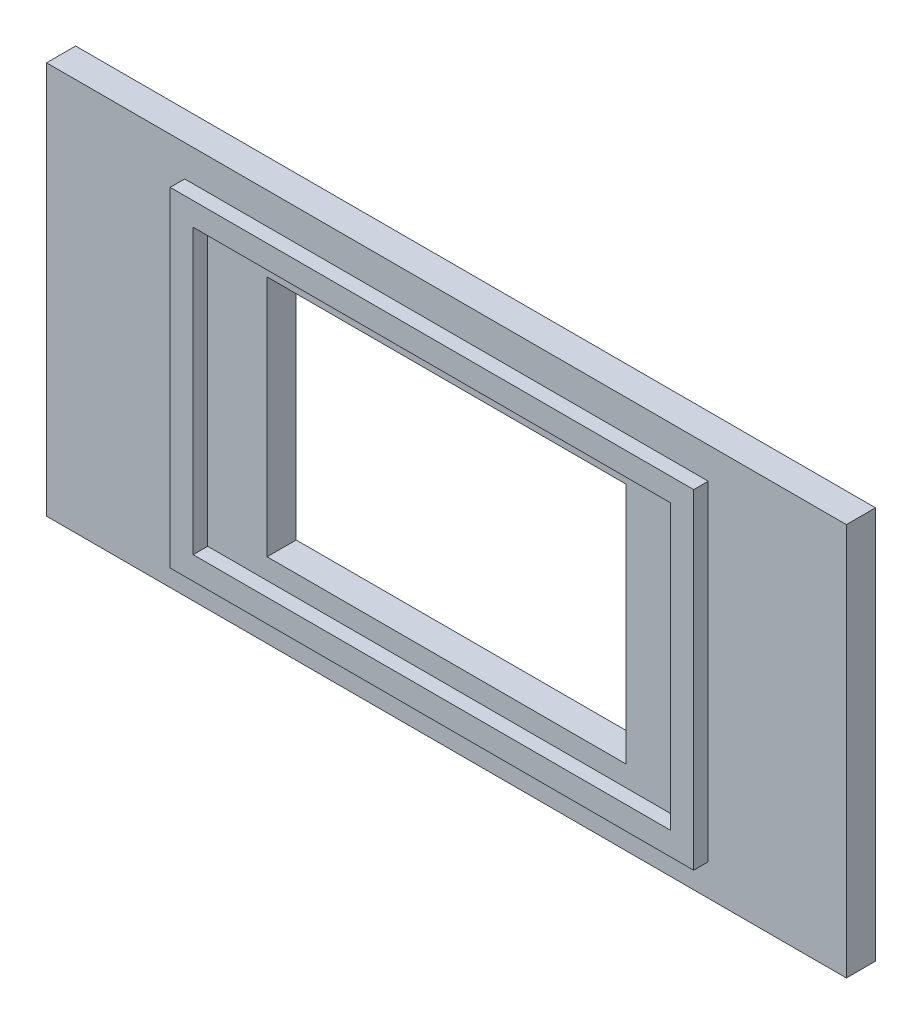
ISO-10303-21;
HEADER;
FILE_DESCRIPTION(('STEP AP214'),'2;1');
FILE_NAME('part.step','',(''),(''),'','','');
FILE_SCHEMA(('AUTOMOTIVE_DESIGN { 1 0 10303 214 1 1 1 1 }'));
ENDSEC;
DATA;
#1=APPLICATION_CONTEXT('core data for automotive mechanical design processes');
#2=APPLICATION_PROTOCOL_DEFINITION('international standard','automotive_design',2000,#1);
#3=PRODUCT_CONTEXT('',#1,'mechanical');
#4=PRODUCT('Part','Part','',(#3));
#5=PRODUCT_RELATED_PRODUCT_CATEGORY('part','',(#4));
#6=PRODUCT_DEFINITION_FORMATION('','',#4);
#7=PRODUCT_DEFINITION_CONTEXT('part definition',#1,'design');
#8=PRODUCT_DEFINITION('design','',#6,#7);
#9=PRODUCT_DEFINITION_SHAPE('','',#8);
#10=(LENGTH_UNIT() NAMED_UNIT(*) SI_UNIT(.MILLI.,.METRE.));
#11=(NAMED_UNIT(*) PLANE_ANGLE_UNIT() SI_UNIT($,.RADIAN.));
#12=(NAMED_UNIT(*) SI_UNIT($,.STERADIAN.) SOLID_ANGLE_UNIT());
#13=UNCERTAINTY_MEASURE_WITH_UNIT(LENGTH_MEASURE(1.E-05),#10,'distance_accuracy_value','');
#14=(GEOMETRIC_REPRESENTATION_CONTEXT(3) GLOBAL_UNCERTAINTY_ASSIGNED_CONTEXT((#13)) GLOBAL_UNIT_ASSIGNED_CONTEXT((#10,
#11,#12)) REPRESENTATION_CONTEXT('',''));
#15=CARTESIAN_POINT('',(0.,0.,0.));
#16=DIRECTION('',(0.,0.,1.));
#17=DIRECTION('',(1.,0.,0.));
#18=AXIS2_PLACEMENT_3D('',#15,#16,#17);
#19=CARTESIAN_POINT('',(0.,0.,6.));
#20=DIRECTION('',(0.,0.,-1.));
#21=DIRECTION('',(-1.,0.,0.));
#22=AXIS2_PLACEMENT_3D('',#19,#20,#21);
#23=PLANE('',#22);
#24=DIRECTION('',(0.,-1.,0.));
#25=VECTOR('',#24,1.);
#26=CARTESIAN_POINT('',(-82.5,-40.5,6.));
#27=LINE('',#26,#25);
#28=CARTESIAN_POINT('',(-82.5,40.5,6.));
#29=VERTEX_POINT('',#28);
#30=CARTESIAN_POINT('',(-82.5,-40.5,6.));
#31=VERTEX_POINT('',#30);
#32=EDGE_CURVE('E258',#29,#31,#27,.T.);
#33=ORIENTED_EDGE('',*,*,#32,.T.);
#34=DIRECTION('',(1.,0.,0.));
#35=VECTOR('',#34,1.);
#36=CARTESIAN_POINT('',(-82.5,-40.5,6.));
#37=LINE('',#36,#35);
#38=CARTESIAN_POINT('',(82.5,-40.5,6.));
#39=VERTEX_POINT('',#38);
#40=EDGE_CURVE('E260',#31,#39,#37,.T.);
#41=ORIENTED_EDGE('',*,*,#40,.T.);
#42=DIRECTION('',(0.,1.,0.));
#43=VECTOR('',#42,1.);
#44=CARTESIAN_POINT('',(82.5,-40.5,6.));
#45=LINE('',#44,#43);
#46=CARTESIAN_POINT('',(82.5,40.5,6.));
#47=VERTEX_POINT('',#46);
#48=EDGE_CURVE('E265',#39,#47,#45,.T.);
#49=ORIENTED_EDGE('',*,*,#48,.T.);
#50=DIRECTION('',(-1.,0.,0.));
#51=VECTOR('',#50,1.);
#52=CARTESIAN_POINT('',(-82.5,40.5,6.));
#53=LINE('',#52,#51);
#54=EDGE_CURVE('E264',#47,#29,#53,.T.);
#55=ORIENTED_EDGE('',*,*,#54,.T.);
#56=EDGE_LOOP('',(#33,#41,#49,#55));
#57=FACE_BOUND('',#56,.T.);
#58=DIRECTION('',(0.,-1.,0.));
#59=VECTOR('',#58,1.);
#60=CARTESIAN_POINT('',(-54.,0.,6.));
#61=LINE('',#60,#59);
#62=CARTESIAN_POINT('',(-54.,34.,6.));
#63=VERTEX_POINT('',#62);
#64=CARTESIAN_POINT('',(-54.,-34.,6.));
#65=VERTEX_POINT('',#64);
#66=EDGE_CURVE('E225',#63,#65,#61,.T.);
#67=ORIENTED_EDGE('',*,*,#66,.F.);
#68=DIRECTION('',(-1.,0.,0.));
#69=VECTOR('',#68,1.);
#70=CARTESIAN_POINT('',(0.,34.,6.));
#71=LINE('',#70,#69);
#72=CARTESIAN_POINT('',(54.,34.,6.));
#73=VERTEX_POINT('',#72);
#74=EDGE_CURVE('E220',#73,#63,#71,.T.);
#75=ORIENTED_EDGE('',*,*,#74,.F.);
#76=DIRECTION('',(0.,1.,0.));
#77=VECTOR('',#76,1.);
#78=CARTESIAN_POINT('',(54.,0.,6.));
#79=LINE('',#78,#77);
#80=CARTESIAN_POINT('',(54.,-34.,6.));
#81=VERTEX_POINT('',#80);
#82=EDGE_CURVE('E63',#81,#73,#79,.T.);
#83=ORIENTED_EDGE('',*,*,#82,.F.);
#84=DIRECTION('',(1.,0.,0.));
#85=VECTOR('',#84,1.);
#86=CARTESIAN_POINT('',(0.,-34.,6.));
#87=LINE('',#86,#85);
#88=EDGE_CURVE('E57',#65,#81,#87,.T.);
#89=ORIENTED_EDGE('',*,*,#88,.F.);
#90=EDGE_LOOP('',(#67,#75,#83,#89));
#91=FACE_BOUND('',#90,.T.);
#92=ADVANCED_FACE('F41',(#57,#91),#23,.F.);
#93=DIRECTION('',(-1.,0.,0.));
#94=VECTOR('',#93,1.);
#95=CARTESIAN_POINT('',(0.,29.25,6.));
#96=LINE('',#95,#94);
#97=CARTESIAN_POINT('',(49.25,29.25,6.));
#98=VERTEX_POINT('',#97);
#99=CARTESIAN_POINT('',(-49.25,29.25,6.));
#100=VERTEX_POINT('',#99);
#101=EDGE_CURVE('E206',#98,#100,#96,.T.);
#102=ORIENTED_EDGE('',*,*,#101,.T.);
#103=DIRECTION('',(0.,-1.,0.));
#104=VECTOR('',#103,1.);
#105=CARTESIAN_POINT('',(-49.25,0.,6.));
#106=LINE('',#105,#104);
#107=CARTESIAN_POINT('',(-49.25,-29.25,6.));
#108=VERTEX_POINT('',#107);
#109=EDGE_CURVE('E214',#100,#108,#106,.T.);
#110=ORIENTED_EDGE('',*,*,#109,.T.);
#111=DIRECTION('',(1.,0.,0.));
#112=VECTOR('',#111,1.);
#113=CARTESIAN_POINT('',(0.,-29.25,6.));
#114=LINE('',#113,#112);
#115=CARTESIAN_POINT('',(49.25,-29.25,6.));
#116=VERTEX_POINT('',#115);
#117=EDGE_CURVE('E169',#108,#116,#114,.T.);
#118=ORIENTED_EDGE('',*,*,#117,.T.);
#119=DIRECTION('',(0.,1.,0.));
#120=VECTOR('',#119,1.);
#121=CARTESIAN_POINT('',(49.25,0.,6.));
#122=LINE('',#121,#120);
#123=EDGE_CURVE('E213',#116,#98,#122,.T.);
#124=ORIENTED_EDGE('',*,*,#123,.T.);
#125=EDGE_LOOP('',(#102,#110,#118,#124));
#126=FACE_BOUND('',#125,.T.);
#127=DIRECTION('',(0.,-1.,0.));
#128=VECTOR('',#127,1.);
#129=CARTESIAN_POINT('',(-37.,-25.,6.));
#130=LINE('',#129,#128);
#131=CARTESIAN_POINT('',(-37.,25.,6.));
#132=VERTEX_POINT('',#131);
#133=CARTESIAN_POINT('',(-37.,-25.,6.));
#134=VERTEX_POINT('',#133);
#135=EDGE_CURVE('E224',#132,#134,#130,.T.);
#136=ORIENTED_EDGE('',*,*,#135,.F.);
#137=DIRECTION('',(-1.,0.,0.));
#138=VECTOR('',#137,1.);
#139=CARTESIAN_POINT('',(-37.,25.,6.));
#140=LINE('',#139,#138);
#141=CARTESIAN_POINT('',(37.,25.,6.));
#142=VERTEX_POINT('',#141);
#143=EDGE_CURVE('E232',#142,#132,#140,.T.);
#144=ORIENTED_EDGE('',*,*,#143,.F.);
#145=DIRECTION('',(0.,1.,0.));
#146=VECTOR('',#145,1.);
#147=CARTESIAN_POINT('',(37.,-25.,6.));
#148=LINE('',#147,#146);
#149=CARTESIAN_POINT('',(37.,-25.,6.));
#150=VERTEX_POINT('',#149);
#151=EDGE_CURVE('E229',#150,#142,#148,.T.);
#152=ORIENTED_EDGE('',*,*,#151,.F.);
#153=DIRECTION('',(1.,0.,0.));
#154=VECTOR('',#153,1.);
#155=CARTESIAN_POINT('',(-37.,-25.,6.));
#156=LINE('',#155,#154);
#157=EDGE_CURVE('E230',#134,#150,#156,.T.);
#158=ORIENTED_EDGE('',*,*,#157,.F.);
#159=EDGE_LOOP('',(#136,#144,#152,#158));
#160=FACE_BOUND('',#159,.T.);
#161=ADVANCED_FACE('F308',(#126,#160),#23,.F.);
#162=CARTESIAN_POINT('',(0.,0.,0.));
#163=DIRECTION('',(0.,0.,-1.));
#164=DIRECTION('',(-1.,0.,0.));
#165=AXIS2_PLACEMENT_3D('',#162,#163,#164);
#166=PLANE('',#165);
#167=DIRECTION('',(-1.,0.,0.));
#168=VECTOR('',#167,1.);
#169=CARTESIAN_POINT('',(-37.,25.,0.));
#170=LINE('',#169,#168);
#171=CARTESIAN_POINT('',(37.,25.,0.));
#172=VERTEX_POINT('',#171);
#173=CARTESIAN_POINT('',(-37.,25.,0.));
#174=VERTEX_POINT('',#173);
#175=EDGE_CURVE('E228',#172,#174,#170,.T.);
#176=ORIENTED_EDGE('',*,*,#175,.T.);
#177=DIRECTION('',(0.,-1.,0.));
#178=VECTOR('',#177,1.);
#179=CARTESIAN_POINT('',(-37.,-25.,0.));
#180=LINE('',#179,#178);
#181=CARTESIAN_POINT('',(-37.,-25.,0.));
#182=VERTEX_POINT('',#181);
#183=EDGE_CURVE('E222',#174,#182,#180,.T.);
#184=ORIENTED_EDGE('',*,*,#183,.T.);
#185=DIRECTION('',(1.,0.,0.));
#186=VECTOR('',#185,1.);
#187=CARTESIAN_POINT('',(-37.,-25.,0.));
#188=LINE('',#187,#186);
#189=CARTESIAN_POINT('',(37.,-25.,0.));
#190=VERTEX_POINT('',#189);
#191=EDGE_CURVE('E239',#182,#190,#188,.T.);
#192=ORIENTED_EDGE('',*,*,#191,.T.);
#193=DIRECTION('',(0.,1.,0.));
#194=VECTOR('',#193,1.);
#195=CARTESIAN_POINT('',(37.,-25.,0.));
#196=LINE('',#195,#194);
#197=EDGE_CURVE('E243',#190,#172,#196,.T.);
#198=ORIENTED_EDGE('',*,*,#197,.T.);
#199=EDGE_LOOP('',(#176,#184,#192,#198));
#200=FACE_BOUND('',#199,.T.);
#201=DIRECTION('',(0.,-1.,0.));
#202=VECTOR('',#201,1.);
#203=CARTESIAN_POINT('',(-82.5,-40.5,0.));
#204=LINE('',#203,#202);
#205=CARTESIAN_POINT('',(-82.5,40.5,0.));
#206=VERTEX_POINT('',#205);
#207=CARTESIAN_POINT('',(-82.5,-40.5,0.));
#208=VERTEX_POINT('',#207);
#209=EDGE_CURVE('E254',#206,#208,#204,.T.);
#210=ORIENTED_EDGE('',*,*,#209,.F.);
#211=DIRECTION('',(-1.,0.,0.));
#212=VECTOR('',#211,1.);
#213=CARTESIAN_POINT('',(-82.5,40.5,0.));
#214=LINE('',#213,#212);
#215=CARTESIAN_POINT('',(82.5,40.5,0.));
#216=VERTEX_POINT('',#215);
#217=EDGE_CURVE('E259',#216,#206,#214,.T.);
#218=ORIENTED_EDGE('',*,*,#217,.F.);
#219=DIRECTION('',(0.,1.,0.));
#220=VECTOR('',#219,1.);
#221=CARTESIAN_POINT('',(82.5,-40.5,0.));
#222=LINE('',#221,#220);
#223=CARTESIAN_POINT('',(82.5,-40.5,0.));
#224=VERTEX_POINT('',#223);
#225=EDGE_CURVE('E271',#224,#216,#222,.T.);
#226=ORIENTED_EDGE('',*,*,#225,.F.);
#227=DIRECTION('',(1.,0.,0.));
#228=VECTOR('',#227,1.);
#229=CARTESIAN_POINT('',(-82.5,-40.5,0.));
#230=LINE('',#229,#228);
#231=EDGE_CURVE('E267',#208,#224,#230,.T.);
#232=ORIENTED_EDGE('',*,*,#231,.F.);
#233=EDGE_LOOP('',(#210,#218,#226,#232));
#234=FACE_BOUND('',#233,.T.);
#235=ADVANCED_FACE('F287',(#200,#234),#166,.T.);
#236=CARTESIAN_POINT('',(-82.5,-40.5,6.));
#237=DIRECTION('',(1.,0.,0.));
#238=DIRECTION('',(0.,0.,-1.));
#239=AXIS2_PLACEMENT_3D('',#236,#237,#238);
#240=PLANE('',#239);
#241=ORIENTED_EDGE('',*,*,#209,.T.);
#242=DIRECTION('',(0.,0.,-1.));
#243=VECTOR('',#242,1.);
#244=CARTESIAN_POINT('',(-82.5,-40.5,6.));
#245=LINE('',#244,#243);
#246=EDGE_CURVE('E11',#31,#208,#245,.T.);
#247=ORIENTED_EDGE('',*,*,#246,.F.);
#248=ORIENTED_EDGE('',*,*,#32,.F.);
#249=DIRECTION('',(0.,0.,-1.));
#250=VECTOR('',#249,1.);
#251=CARTESIAN_POINT('',(-82.5,40.5,6.));
#252=LINE('',#251,#250);
#253=EDGE_CURVE('E266',#29,#206,#252,.T.);
#254=ORIENTED_EDGE('',*,*,#253,.T.);
#255=EDGE_LOOP('',(#241,#247,#248,#254));
#256=FACE_BOUND('',#255,.T.);
#257=ADVANCED_FACE('F43',(#256),#240,.F.);
#258=CARTESIAN_POINT('',(-82.5,-40.5,6.));
#259=DIRECTION('',(0.,1.,0.));
#260=DIRECTION('',(0.,0.,1.));
#261=AXIS2_PLACEMENT_3D('',#258,#259,#260);
#262=PLANE('',#261);
#263=ORIENTED_EDGE('',*,*,#231,.T.);
#264=DIRECTION('',(0.,0.,-1.));
#265=VECTOR('',#264,1.);
#266=CARTESIAN_POINT('',(82.5,-40.5,6.));
#267=LINE('',#266,#265);
#268=EDGE_CURVE('E47',#39,#224,#267,.T.);
#269=ORIENTED_EDGE('',*,*,#268,.F.);
#270=ORIENTED_EDGE('',*,*,#40,.F.);
#271=ORIENTED_EDGE('',*,*,#246,.T.);
#272=EDGE_LOOP('',(#263,#269,#270,#271));
#273=FACE_BOUND('',#272,.T.);
#274=ADVANCED_FACE('F296',(#273),#262,.F.);
#275=CARTESIAN_POINT('',(82.5,-40.5,6.));
#276=DIRECTION('',(-1.,0.,0.));
#277=DIRECTION('',(0.,0.,1.));
#278=AXIS2_PLACEMENT_3D('',#275,#276,#277);
#279=PLANE('',#278);
#280=ORIENTED_EDGE('',*,*,#225,.T.);
#281=DIRECTION('',(0.,0.,-1.));
#282=VECTOR('',#281,1.);
#283=CARTESIAN_POINT('',(82.5,40.5,6.));
#284=LINE('',#283,#282);
#285=EDGE_CURVE('E276',#47,#216,#284,.T.);
#286=ORIENTED_EDGE('',*,*,#285,.F.);
#287=ORIENTED_EDGE('',*,*,#48,.F.);
#288=ORIENTED_EDGE('',*,*,#268,.T.);
#289=EDGE_LOOP('',(#280,#286,#287,#288));
#290=FACE_BOUND('',#289,.T.);
#291=ADVANCED_FACE('F284',(#290),#279,.F.);
#292=CARTESIAN_POINT('',(-82.5,40.5,6.));
#293=DIRECTION('',(0.,-1.,0.));
#294=DIRECTION('',(0.,0.,-1.));
#295=AXIS2_PLACEMENT_3D('',#292,#293,#294);
#296=PLANE('',#295);
#297=ORIENTED_EDGE('',*,*,#217,.T.);
#298=ORIENTED_EDGE('',*,*,#253,.F.);
#299=ORIENTED_EDGE('',*,*,#54,.F.);
#300=ORIENTED_EDGE('',*,*,#285,.T.);
#301=EDGE_LOOP('',(#297,#298,#299,#300));
#302=FACE_BOUND('',#301,.T.);
#303=ADVANCED_FACE('F295',(#302),#296,.F.);
#304=CARTESIAN_POINT('',(-37.,-25.,6.));
#305=DIRECTION('',(1.,0.,0.));
#306=DIRECTION('',(0.,0.,-1.));
#307=AXIS2_PLACEMENT_3D('',#304,#305,#306);
#308=PLANE('',#307);
#309=ORIENTED_EDGE('',*,*,#183,.F.);
#310=DIRECTION('',(0.,0.,-1.));
#311=VECTOR('',#310,1.);
#312=CARTESIAN_POINT('',(-37.,25.,6.));
#313=LINE('',#312,#311);
#314=EDGE_CURVE('E234',#132,#174,#313,.T.);
#315=ORIENTED_EDGE('',*,*,#314,.F.);
#316=ORIENTED_EDGE('',*,*,#135,.T.);
#317=DIRECTION('',(0.,0.,-1.));
#318=VECTOR('',#317,1.);
#319=CARTESIAN_POINT('',(-37.,-25.,6.));
#320=LINE('',#319,#318);
#321=EDGE_CURVE('E255',#134,#182,#320,.T.);
#322=ORIENTED_EDGE('',*,*,#321,.T.);
#323=EDGE_LOOP('',(#309,#315,#316,#322));
#324=FACE_BOUND('',#323,.T.);
#325=ADVANCED_FACE('F314',(#324),#308,.T.);
#326=CARTESIAN_POINT('',(-37.,-25.,6.));
#327=DIRECTION('',(0.,1.,0.));
#328=DIRECTION('',(0.,0.,1.));
#329=AXIS2_PLACEMENT_3D('',#326,#327,#328);
#330=PLANE('',#329);
#331=ORIENTED_EDGE('',*,*,#191,.F.);
#332=ORIENTED_EDGE('',*,*,#321,.F.);
#333=ORIENTED_EDGE('',*,*,#157,.T.);
#334=DIRECTION('',(0.,0.,-1.));
#335=VECTOR('',#334,1.);
#336=CARTESIAN_POINT('',(37.,-25.,6.));
#337=LINE('',#336,#335);
#338=EDGE_CURVE('E248',#150,#190,#337,.T.);
#339=ORIENTED_EDGE('',*,*,#338,.T.);
#340=EDGE_LOOP('',(#331,#332,#333,#339));
#341=FACE_BOUND('',#340,.T.);
#342=ADVANCED_FACE('F323',(#341),#330,.T.);
#343=CARTESIAN_POINT('',(37.,-25.,6.));
#344=DIRECTION('',(-1.,0.,0.));
#345=DIRECTION('',(0.,0.,1.));
#346=AXIS2_PLACEMENT_3D('',#343,#344,#345);
#347=PLANE('',#346);
#348=ORIENTED_EDGE('',*,*,#197,.F.);
#349=ORIENTED_EDGE('',*,*,#338,.F.);
#350=ORIENTED_EDGE('',*,*,#151,.T.);
#351=DIRECTION('',(0.,0.,-1.));
#352=VECTOR('',#351,1.);
#353=CARTESIAN_POINT('',(37.,25.,6.));
#354=LINE('',#353,#352);
#355=EDGE_CURVE('E246',#142,#172,#354,.T.);
#356=ORIENTED_EDGE('',*,*,#355,.T.);
#357=EDGE_LOOP('',(#348,#349,#350,#356));
#358=FACE_BOUND('',#357,.T.);
#359=ADVANCED_FACE('F326',(#358),#347,.T.);
#360=CARTESIAN_POINT('',(-37.,25.,6.));
#361=DIRECTION('',(0.,-1.,0.));
#362=DIRECTION('',(0.,0.,-1.));
#363=AXIS2_PLACEMENT_3D('',#360,#361,#362);
#364=PLANE('',#363);
#365=ORIENTED_EDGE('',*,*,#175,.F.);
#366=ORIENTED_EDGE('',*,*,#355,.F.);
#367=ORIENTED_EDGE('',*,*,#143,.T.);
#368=ORIENTED_EDGE('',*,*,#314,.T.);
#369=EDGE_LOOP('',(#365,#366,#367,#368));
#370=FACE_BOUND('',#369,.T.);
#371=ADVANCED_FACE('F337',(#370),#364,.T.);
#372=CARTESIAN_POINT('',(-54.,-34.,9.));
#373=DIRECTION('',(1.,0.,0.));
#374=DIRECTION('',(0.,0.,-1.));
#375=AXIS2_PLACEMENT_3D('',#372,#373,#374);
#376=PLANE('',#375);
#377=DIRECTION('',(0.,0.,-1.));
#378=VECTOR('',#377,1.);
#379=CARTESIAN_POINT('',(-54.,34.,9.));
#380=LINE('',#379,#378);
#381=CARTESIAN_POINT('',(-54.,34.,9.));
#382=VERTEX_POINT('',#381);
#383=EDGE_CURVE('E198',#382,#63,#380,.T.);
#384=ORIENTED_EDGE('',*,*,#383,.T.);
#385=ORIENTED_EDGE('',*,*,#66,.T.);
#386=DIRECTION('',(0.,0.,-1.));
#387=VECTOR('',#386,1.);
#388=CARTESIAN_POINT('',(-54.,-34.,9.));
#389=LINE('',#388,#387);
#390=CARTESIAN_POINT('',(-54.,-34.,9.));
#391=VERTEX_POINT('',#390);
#392=EDGE_CURVE('E203',#391,#65,#389,.T.);
#393=ORIENTED_EDGE('',*,*,#392,.F.);
#394=DIRECTION('',(0.,-1.,0.));
#395=VECTOR('',#394,1.);
#396=CARTESIAN_POINT('',(-54.,-34.,9.));
#397=LINE('',#396,#395);
#398=EDGE_CURVE('E173',#382,#391,#397,.T.);
#399=ORIENTED_EDGE('',*,*,#398,.F.);
#400=EDGE_LOOP('',(#384,#385,#393,#399));
#401=FACE_BOUND('',#400,.T.);
#402=ADVANCED_FACE('F346',(#401),#376,.F.);
#403=CARTESIAN_POINT('',(-54.,-34.,9.));
#404=DIRECTION('',(0.,1.,0.));
#405=DIRECTION('',(0.,0.,1.));
#406=AXIS2_PLACEMENT_3D('',#403,#404,#405);
#407=PLANE('',#406);
#408=ORIENTED_EDGE('',*,*,#392,.T.);
#409=ORIENTED_EDGE('',*,*,#88,.T.);
#410=DIRECTION('',(0.,0.,-1.));
#411=VECTOR('',#410,1.);
#412=CARTESIAN_POINT('',(54.,-34.,9.));
#413=LINE('',#412,#411);
#414=CARTESIAN_POINT('',(54.,-34.,9.));
#415=VERTEX_POINT('',#414);
#416=EDGE_CURVE('E205',#415,#81,#413,.T.);
#417=ORIENTED_EDGE('',*,*,#416,.F.);
#418=DIRECTION('',(1.,0.,0.));
#419=VECTOR('',#418,1.);
#420=CARTESIAN_POINT('',(-54.,-34.,9.));
#421=LINE('',#420,#419);
#422=EDGE_CURVE('E189',#391,#415,#421,.T.);
#423=ORIENTED_EDGE('',*,*,#422,.F.);
#424=EDGE_LOOP('',(#408,#409,#417,#423));
#425=FACE_BOUND('',#424,.T.);
#426=ADVANCED_FACE('F351',(#425),#407,.F.);
#427=CARTESIAN_POINT('',(54.,-34.,9.));
#428=DIRECTION('',(-1.,0.,0.));
#429=DIRECTION('',(0.,0.,1.));
#430=AXIS2_PLACEMENT_3D('',#427,#428,#429);
#431=PLANE('',#430);
#432=ORIENTED_EDGE('',*,*,#416,.T.);
#433=ORIENTED_EDGE('',*,*,#82,.T.);
#434=DIRECTION('',(0.,0.,-1.));
#435=VECTOR('',#434,1.);
#436=CARTESIAN_POINT('',(54.,34.,9.));
#437=LINE('',#436,#435);
#438=CARTESIAN_POINT('',(54.,34.,9.));
#439=VERTEX_POINT('',#438);
#440=EDGE_CURVE('E197',#439,#73,#437,.T.);
#441=ORIENTED_EDGE('',*,*,#440,.F.);
#442=DIRECTION('',(0.,1.,0.));
#443=VECTOR('',#442,1.);
#444=CARTESIAN_POINT('',(54.,-34.,9.));
#445=LINE('',#444,#443);
#446=EDGE_CURVE('E195',#415,#439,#445,.T.);
#447=ORIENTED_EDGE('',*,*,#446,.F.);
#448=EDGE_LOOP('',(#432,#433,#441,#447));
#449=FACE_BOUND('',#448,.T.);
#450=ADVANCED_FACE('F360',(#449),#431,.F.);
#451=CARTESIAN_POINT('',(-54.,34.,9.));
#452=DIRECTION('',(0.,-1.,0.));
#453=DIRECTION('',(0.,0.,-1.));
#454=AXIS2_PLACEMENT_3D('',#451,#452,#453);
#455=PLANE('',#454);
#456=ORIENTED_EDGE('',*,*,#440,.T.);
#457=ORIENTED_EDGE('',*,*,#74,.T.);
#458=ORIENTED_EDGE('',*,*,#383,.F.);
#459=DIRECTION('',(-1.,0.,0.));
#460=VECTOR('',#459,1.);
#461=CARTESIAN_POINT('',(-54.,34.,9.));
#462=LINE('',#461,#460);
#463=EDGE_CURVE('E191',#439,#382,#462,.T.);
#464=ORIENTED_EDGE('',*,*,#463,.F.);
#465=EDGE_LOOP('',(#456,#457,#458,#464));
#466=FACE_BOUND('',#465,.T.);
#467=ADVANCED_FACE('F361',(#466),#455,.F.);
#468=CARTESIAN_POINT('',(-49.25,-29.25,9.));
#469=DIRECTION('',(1.,0.,0.));
#470=DIRECTION('',(0.,0.,-1.));
#471=AXIS2_PLACEMENT_3D('',#468,#469,#470);
#472=PLANE('',#471);
#473=ORIENTED_EDGE('',*,*,#109,.F.);
#474=DIRECTION('',(0.,0.,-1.));
#475=VECTOR('',#474,1.);
#476=CARTESIAN_POINT('',(-49.25,29.25,9.));
#477=LINE('',#476,#475);
#478=CARTESIAN_POINT('',(-49.25,29.25,9.));
#479=VERTEX_POINT('',#478);
#480=EDGE_CURVE('E159',#479,#100,#477,.T.);
#481=ORIENTED_EDGE('',*,*,#480,.F.);
#482=DIRECTION('',(0.,-1.,0.));
#483=VECTOR('',#482,1.);
#484=CARTESIAN_POINT('',(-49.25,-29.25,9.));
#485=LINE('',#484,#483);
#486=CARTESIAN_POINT('',(-49.25,-29.25,9.));
#487=VERTEX_POINT('',#486);
#488=EDGE_CURVE('E151',#479,#487,#485,.T.);
#489=ORIENTED_EDGE('',*,*,#488,.T.);
#490=DIRECTION('',(0.,0.,-1.));
#491=VECTOR('',#490,1.);
#492=CARTESIAN_POINT('',(-49.25,-29.25,9.));
#493=LINE('',#492,#491);
#494=EDGE_CURVE('E160',#487,#108,#493,.T.);
#495=ORIENTED_EDGE('',*,*,#494,.T.);
#496=EDGE_LOOP('',(#473,#481,#489,#495));
#497=FACE_BOUND('',#496,.T.);
#498=ADVANCED_FACE('F157',(#497),#472,.T.);
#499=CARTESIAN_POINT('',(-49.25,-29.25,9.));
#500=DIRECTION('',(0.,1.,0.));
#501=DIRECTION('',(0.,0.,1.));
#502=AXIS2_PLACEMENT_3D('',#499,#500,#501);
#503=PLANE('',#502);
#504=ORIENTED_EDGE('',*,*,#117,.F.);
#505=ORIENTED_EDGE('',*,*,#494,.F.);
#506=DIRECTION('',(1.,0.,0.));
#507=VECTOR('',#506,1.);
#508=CARTESIAN_POINT('',(-49.25,-29.25,9.));
#509=LINE('',#508,#507);
#510=CARTESIAN_POINT('',(49.25,-29.25,9.));
#511=VERTEX_POINT('',#510);
#512=EDGE_CURVE('E161',#487,#511,#509,.T.);
#513=ORIENTED_EDGE('',*,*,#512,.T.);
#514=DIRECTION('',(0.,0.,-1.));
#515=VECTOR('',#514,1.);
#516=CARTESIAN_POINT('',(49.25,-29.25,9.));
#517=LINE('',#516,#515);
#518=EDGE_CURVE('E175',#511,#116,#517,.T.);
#519=ORIENTED_EDGE('',*,*,#518,.T.);
#520=EDGE_LOOP('',(#504,#505,#513,#519));
#521=FACE_BOUND('',#520,.T.);
#522=ADVANCED_FACE('F168',(#521),#503,.T.);
#523=CARTESIAN_POINT('',(49.25,-29.25,9.));
#524=DIRECTION('',(-1.,0.,0.));
#525=DIRECTION('',(0.,0.,1.));
#526=AXIS2_PLACEMENT_3D('',#523,#524,#525);
#527=PLANE('',#526);
#528=ORIENTED_EDGE('',*,*,#123,.F.);
#529=ORIENTED_EDGE('',*,*,#518,.F.);
#530=DIRECTION('',(0.,1.,0.));
#531=VECTOR('',#530,1.);
#532=CARTESIAN_POINT('',(49.25,-29.25,9.));
#533=LINE('',#532,#531);
#534=CARTESIAN_POINT('',(49.25,29.25,9.));
#535=VERTEX_POINT('',#534);
#536=EDGE_CURVE('E180',#511,#535,#533,.T.);
#537=ORIENTED_EDGE('',*,*,#536,.T.);
#538=DIRECTION('',(0.,0.,-1.));
#539=VECTOR('',#538,1.);
#540=CARTESIAN_POINT('',(49.25,29.25,9.));
#541=LINE('',#540,#539);
#542=EDGE_CURVE('E182',#535,#98,#541,.T.);
#543=ORIENTED_EDGE('',*,*,#542,.T.);
#544=EDGE_LOOP('',(#528,#529,#537,#543));
#545=FACE_BOUND('',#544,.T.);
#546=ADVANCED_FACE('F371',(#545),#527,.T.);
#547=CARTESIAN_POINT('',(-49.25,29.25,9.));
#548=DIRECTION('',(0.,-1.,0.));
#549=DIRECTION('',(0.,0.,-1.));
#550=AXIS2_PLACEMENT_3D('',#547,#548,#549);
#551=PLANE('',#550);
#552=ORIENTED_EDGE('',*,*,#101,.F.);
#553=ORIENTED_EDGE('',*,*,#542,.F.);
#554=DIRECTION('',(-1.,0.,0.));
#555=VECTOR('',#554,1.);
#556=CARTESIAN_POINT('',(-49.25,29.25,9.));
#557=LINE('',#556,#555);
#558=EDGE_CURVE('E177',#535,#479,#557,.T.);
#559=ORIENTED_EDGE('',*,*,#558,.T.);
#560=ORIENTED_EDGE('',*,*,#480,.T.);
#561=EDGE_LOOP('',(#552,#553,#559,#560));
#562=FACE_BOUND('',#561,.T.);
#563=ADVANCED_FACE('F367',(#562),#551,.T.);
#564=CARTESIAN_POINT('',(0.,0.,9.));
#565=DIRECTION('',(0.,0.,-1.));
#566=DIRECTION('',(-1.,0.,0.));
#567=AXIS2_PLACEMENT_3D('',#564,#565,#566);
#568=PLANE('',#567);
#569=ORIENTED_EDGE('',*,*,#398,.T.);
#570=ORIENTED_EDGE('',*,*,#422,.T.);
#571=ORIENTED_EDGE('',*,*,#446,.T.);
#572=ORIENTED_EDGE('',*,*,#463,.T.);
#573=EDGE_LOOP('',(#569,#570,#571,#572));
#574=FACE_BOUND('',#573,.T.);
#575=ORIENTED_EDGE('',*,*,#488,.F.);
#576=ORIENTED_EDGE('',*,*,#558,.F.);
#577=ORIENTED_EDGE('',*,*,#536,.F.);
#578=ORIENTED_EDGE('',*,*,#512,.F.);
#579=EDGE_LOOP('',(#575,#576,#577,#578));
#580=FACE_BOUND('',#579,.T.);
#581=ADVANCED_FACE('F172',(#574,#580),#568,.F.);
#582=CLOSED_SHELL('',(#92,#161,#235,#257,#274,#291,#303,#325,#342,#359,#371,#402,#426,#450,#467,
#498,#522,#546,#563,#581));
#583=MANIFOLD_SOLID_BREP('B2',#582);
#584=ADVANCED_BREP_SHAPE_REPRESENTATION('',(#18,#583),#14);
#585=SHAPE_DEFINITION_REPRESENTATION(#9,#584);
ENDSEC;
END-ISO-10303-21;
